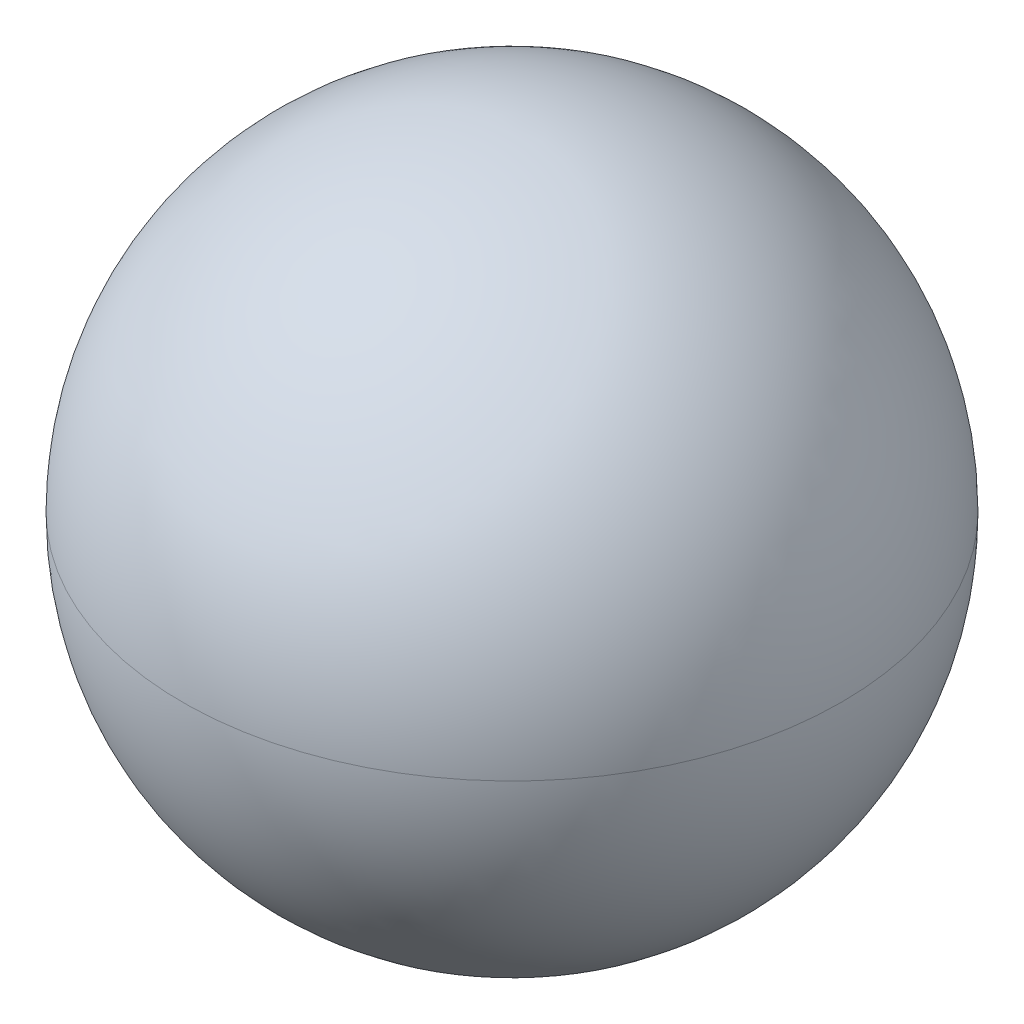
ISO-10303-21;
HEADER;
FILE_DESCRIPTION(('STEP AP214'),'2;1');
FILE_NAME('part.step','',(''),(''),'','','');
FILE_SCHEMA(('AUTOMOTIVE_DESIGN { 1 0 10303 214 1 1 1 1 }'));
ENDSEC;
DATA;
#1=APPLICATION_CONTEXT('core data for automotive mechanical design processes');
#2=APPLICATION_PROTOCOL_DEFINITION('international standard','automotive_design',2000,#1);
#3=PRODUCT_CONTEXT('',#1,'mechanical');
#4=PRODUCT('Part','Part','',(#3));
#5=PRODUCT_RELATED_PRODUCT_CATEGORY('part','',(#4));
#6=PRODUCT_DEFINITION_FORMATION('','',#4);
#7=PRODUCT_DEFINITION_CONTEXT('part definition',#1,'design');
#8=PRODUCT_DEFINITION('design','',#6,#7);
#9=PRODUCT_DEFINITION_SHAPE('','',#8);
#10=(LENGTH_UNIT() NAMED_UNIT(*) SI_UNIT(.MILLI.,.METRE.));
#11=(NAMED_UNIT(*) PLANE_ANGLE_UNIT() SI_UNIT($,.RADIAN.));
#12=(NAMED_UNIT(*) SI_UNIT($,.STERADIAN.) SOLID_ANGLE_UNIT());
#13=UNCERTAINTY_MEASURE_WITH_UNIT(LENGTH_MEASURE(1.E-05),#10,'distance_accuracy_value','');
#14=(GEOMETRIC_REPRESENTATION_CONTEXT(3) GLOBAL_UNCERTAINTY_ASSIGNED_CONTEXT((#13)) GLOBAL_UNIT_ASSIGNED_CONTEXT((#10,
#11,#12)) REPRESENTATION_CONTEXT('',''));
#15=CARTESIAN_POINT('',(0.,0.,0.));
#16=DIRECTION('',(0.,0.,1.));
#17=DIRECTION('',(1.,0.,0.));
#18=AXIS2_PLACEMENT_3D('',#15,#16,#17);
#19=CARTESIAN_POINT('',(0.,0.,0.));
#20=DIRECTION('',(0.,1.,0.));
#21=DIRECTION('',(1.,0.,0.));
#22=AXIS2_PLACEMENT_3D('',#19,#20,#21);
#23=SPHERICAL_SURFACE('',#22,108.);
#24=CARTESIAN_POINT('',(0.,0.,0.));
#25=DIRECTION('',(0.,-1.,0.));
#26=DIRECTION('',(0.,0.,-1.));
#27=AXIS2_PLACEMENT_3D('',#24,#25,#26);
#28=CIRCLE('',#27,108.);
#29=CARTESIAN_POINT('',(0.,0.,-108.));
#30=VERTEX_POINT('',#29);
#31=EDGE_CURVE('E10',#30,#30,#28,.T.);
#32=ORIENTED_EDGE('',*,*,#31,.T.);
#33=EDGE_LOOP('',(#32));
#34=FACE_BOUND('',#33,.T.);
#35=ADVANCED_FACE('F37',(#34),#23,.T.);
#36=ORIENTED_EDGE('',*,*,#31,.F.);
#37=EDGE_LOOP('',(#36));
#38=FACE_BOUND('',#37,.T.);
#39=ADVANCED_FACE('F39',(#38),#23,.T.);
#40=CLOSED_SHELL('',(#35,#39));
#41=MANIFOLD_SOLID_BREP('B2',#40);
#42=ADVANCED_BREP_SHAPE_REPRESENTATION('',(#18,#41),#14);
#43=SHAPE_DEFINITION_REPRESENTATION(#9,#42);
ENDSEC;
END-ISO-10303-21;
